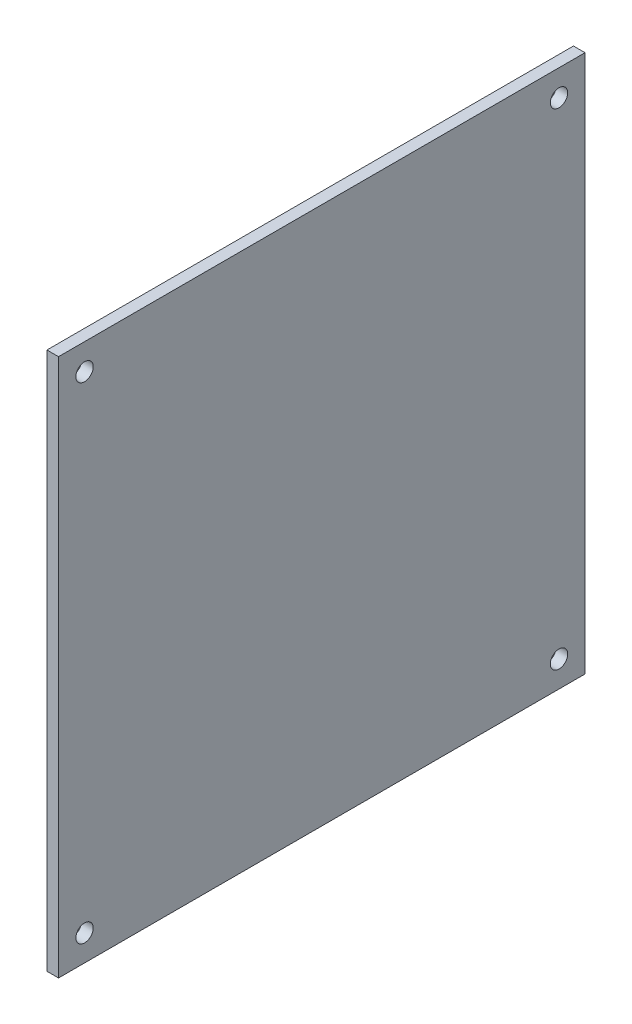
ISO-10303-21;
HEADER;
FILE_DESCRIPTION(('STEP AP214'),'2;1');
FILE_NAME('part.step','',(''),(''),'','','');
FILE_SCHEMA(('AUTOMOTIVE_DESIGN { 1 0 10303 214 1 1 1 1 }'));
ENDSEC;
DATA;
#1=APPLICATION_CONTEXT('core data for automotive mechanical design processes');
#2=APPLICATION_PROTOCOL_DEFINITION('international standard','automotive_design',2000,#1);
#3=PRODUCT_CONTEXT('',#1,'mechanical');
#4=PRODUCT('Part','Part','',(#3));
#5=PRODUCT_RELATED_PRODUCT_CATEGORY('part','',(#4));
#6=PRODUCT_DEFINITION_FORMATION('','',#4);
#7=PRODUCT_DEFINITION_CONTEXT('part definition',#1,'design');
#8=PRODUCT_DEFINITION('design','',#6,#7);
#9=PRODUCT_DEFINITION_SHAPE('','',#8);
#10=(LENGTH_UNIT() NAMED_UNIT(*) SI_UNIT(.MILLI.,.METRE.));
#11=(NAMED_UNIT(*) PLANE_ANGLE_UNIT() SI_UNIT($,.RADIAN.));
#12=(NAMED_UNIT(*) SI_UNIT($,.STERADIAN.) SOLID_ANGLE_UNIT());
#13=UNCERTAINTY_MEASURE_WITH_UNIT(LENGTH_MEASURE(1.E-05),#10,'distance_accuracy_value','');
#14=(GEOMETRIC_REPRESENTATION_CONTEXT(3) GLOBAL_UNCERTAINTY_ASSIGNED_CONTEXT((#13)) GLOBAL_UNIT_ASSIGNED_CONTEXT((#10,
#11,#12)) REPRESENTATION_CONTEXT('',''));
#15=CARTESIAN_POINT('',(0.,0.,0.));
#16=DIRECTION('',(0.,0.,1.));
#17=DIRECTION('',(1.,0.,0.));
#18=AXIS2_PLACEMENT_3D('',#15,#16,#17);
#19=CARTESIAN_POINT('',(2.,0.,0.));
#20=DIRECTION('',(1.,0.,0.));
#21=DIRECTION('',(0.,0.,-1.));
#22=AXIS2_PLACEMENT_3D('',#19,#20,#21);
#23=PLANE('',#22);
#24=CARTESIAN_POINT('',(2.,-38.802143102271,-55.6294933567625));
#25=DIRECTION('',(1.,0.,0.));
#26=DIRECTION('',(0.,0.,-1.));
#27=AXIS2_PLACEMENT_3D('',#24,#25,#26);
#28=CIRCLE('',#27,1.5);
#29=CARTESIAN_POINT('',(2.,-38.802143102271,-57.1294933567625));
#30=VERTEX_POINT('',#29);
#31=EDGE_CURVE('E123',#30,#30,#28,.T.);
#32=ORIENTED_EDGE('',*,*,#31,.F.);
#33=EDGE_LOOP('',(#32));
#34=FACE_BOUND('',#33,.T.);
#35=CARTESIAN_POINT('',(2.,45.197856897729,26.3705066432375));
#36=DIRECTION('',(1.,0.,0.));
#37=DIRECTION('',(0.,0.,-1.));
#38=AXIS2_PLACEMENT_3D('',#35,#36,#37);
#39=CIRCLE('',#38,1.5);
#40=CARTESIAN_POINT('',(2.,45.197856897729,24.8705066432375));
#41=VERTEX_POINT('',#40);
#42=EDGE_CURVE('E102',#41,#41,#39,.T.);
#43=ORIENTED_EDGE('',*,*,#42,.F.);
#44=EDGE_LOOP('',(#43));
#45=FACE_BOUND('',#44,.T.);
#46=DIRECTION('',(0.,-1.,0.));
#47=VECTOR('',#46,1.);
#48=CARTESIAN_POINT('',(2.,49.697856897729,30.8705066432375));
#49=LINE('',#48,#47);
#50=CARTESIAN_POINT('',(2.,49.697856897729,30.8705066432375));
#51=VERTEX_POINT('',#50);
#52=CARTESIAN_POINT('',(2.,-43.302143102271,30.8705066432375));
#53=VERTEX_POINT('',#52);
#54=EDGE_CURVE('E87',#51,#53,#49,.T.);
#55=ORIENTED_EDGE('',*,*,#54,.T.);
#56=DIRECTION('',(0.,0.,-1.));
#57=VECTOR('',#56,1.);
#58=CARTESIAN_POINT('',(2.,-43.302143102271,30.8705066432375));
#59=LINE('',#58,#57);
#60=CARTESIAN_POINT('',(2.,-43.302143102271,-60.1294933567625));
#61=VERTEX_POINT('',#60);
#62=EDGE_CURVE('E82',#53,#61,#59,.T.);
#63=ORIENTED_EDGE('',*,*,#62,.T.);
#64=DIRECTION('',(0.,1.,0.));
#65=VECTOR('',#64,1.);
#66=CARTESIAN_POINT('',(2.,49.697856897729,-60.1294933567625));
#67=LINE('',#66,#65);
#68=CARTESIAN_POINT('',(2.,49.697856897729,-60.1294933567625));
#69=VERTEX_POINT('',#68);
#70=EDGE_CURVE('E85',#61,#69,#67,.T.);
#71=ORIENTED_EDGE('',*,*,#70,.T.);
#72=DIRECTION('',(0.,0.,1.));
#73=VECTOR('',#72,1.);
#74=CARTESIAN_POINT('',(2.,49.697856897729,30.8705066432375));
#75=LINE('',#74,#73);
#76=EDGE_CURVE('E52',#69,#51,#75,.T.);
#77=ORIENTED_EDGE('',*,*,#76,.T.);
#78=EDGE_LOOP('',(#55,#63,#71,#77));
#79=FACE_BOUND('',#78,.T.);
#80=CARTESIAN_POINT('',(2.,45.197856897729,-55.6294933567625));
#81=DIRECTION('',(1.,0.,0.));
#82=DIRECTION('',(0.,0.,1.));
#83=AXIS2_PLACEMENT_3D('',#80,#81,#82);
#84=CIRCLE('',#83,1.5);
#85=CARTESIAN_POINT('',(2.,45.197856897729,-54.1294933567625));
#86=VERTEX_POINT('',#85);
#87=EDGE_CURVE('E117',#86,#86,#84,.T.);
#88=ORIENTED_EDGE('',*,*,#87,.F.);
#89=EDGE_LOOP('',(#88));
#90=FACE_BOUND('',#89,.T.);
#91=CARTESIAN_POINT('',(2.,-38.802143102271,26.3705066432375));
#92=DIRECTION('',(1.,0.,0.));
#93=DIRECTION('',(0.,0.,1.));
#94=AXIS2_PLACEMENT_3D('',#91,#92,#93);
#95=CIRCLE('',#94,1.5);
#96=CARTESIAN_POINT('',(2.,-38.802143102271,27.8705066432375));
#97=VERTEX_POINT('',#96);
#98=EDGE_CURVE('E129',#97,#97,#95,.T.);
#99=ORIENTED_EDGE('',*,*,#98,.F.);
#100=EDGE_LOOP('',(#99));
#101=FACE_BOUND('',#100,.T.);
#102=ADVANCED_FACE('F35',(#34,#45,#79,#90,#101),#23,.T.);
#103=CARTESIAN_POINT('',(0.,0.,0.));
#104=DIRECTION('',(1.,0.,0.));
#105=DIRECTION('',(0.,0.,-1.));
#106=AXIS2_PLACEMENT_3D('',#103,#104,#105);
#107=PLANE('',#106);
#108=DIRECTION('',(0.,-1.,0.));
#109=VECTOR('',#108,1.);
#110=CARTESIAN_POINT('',(0.,49.697856897729,30.8705066432375));
#111=LINE('',#110,#109);
#112=CARTESIAN_POINT('',(0.,49.697856897729,30.8705066432375));
#113=VERTEX_POINT('',#112);
#114=CARTESIAN_POINT('',(0.,-43.302143102271,30.8705066432375));
#115=VERTEX_POINT('',#114);
#116=EDGE_CURVE('E99',#113,#115,#111,.T.);
#117=ORIENTED_EDGE('',*,*,#116,.F.);
#118=DIRECTION('',(0.,0.,1.));
#119=VECTOR('',#118,1.);
#120=CARTESIAN_POINT('',(0.,49.697856897729,30.8705066432375));
#121=LINE('',#120,#119);
#122=CARTESIAN_POINT('',(0.,49.697856897729,-60.1294933567625));
#123=VERTEX_POINT('',#122);
#124=EDGE_CURVE('E75',#123,#113,#121,.T.);
#125=ORIENTED_EDGE('',*,*,#124,.F.);
#126=DIRECTION('',(0.,1.,0.));
#127=VECTOR('',#126,1.);
#128=CARTESIAN_POINT('',(0.,49.697856897729,-60.1294933567625));
#129=LINE('',#128,#127);
#130=CARTESIAN_POINT('',(0.,-43.302143102271,-60.1294933567625));
#131=VERTEX_POINT('',#130);
#132=EDGE_CURVE('E69',#131,#123,#129,.T.);
#133=ORIENTED_EDGE('',*,*,#132,.F.);
#134=DIRECTION('',(0.,0.,-1.));
#135=VECTOR('',#134,1.);
#136=CARTESIAN_POINT('',(0.,-43.302143102271,30.8705066432375));
#137=LINE('',#136,#135);
#138=EDGE_CURVE('E91',#115,#131,#137,.T.);
#139=ORIENTED_EDGE('',*,*,#138,.F.);
#140=EDGE_LOOP('',(#117,#125,#133,#139));
#141=FACE_BOUND('',#140,.T.);
#142=CARTESIAN_POINT('',(0.,45.197856897729,26.3705066432375));
#143=DIRECTION('',(1.,0.,0.));
#144=DIRECTION('',(0.,0.,-1.));
#145=AXIS2_PLACEMENT_3D('',#142,#143,#144);
#146=CIRCLE('',#145,1.5);
#147=CARTESIAN_POINT('',(0.,45.197856897729,24.8705066432375));
#148=VERTEX_POINT('',#147);
#149=EDGE_CURVE('E114',#148,#148,#146,.T.);
#150=ORIENTED_EDGE('',*,*,#149,.T.);
#151=EDGE_LOOP('',(#150));
#152=FACE_BOUND('',#151,.T.);
#153=CARTESIAN_POINT('',(0.,45.197856897729,-55.6294933567625));
#154=DIRECTION('',(1.,0.,0.));
#155=DIRECTION('',(0.,0.,1.));
#156=AXIS2_PLACEMENT_3D('',#153,#154,#155);
#157=CIRCLE('',#156,1.5);
#158=CARTESIAN_POINT('',(0.,45.197856897729,-54.1294933567625));
#159=VERTEX_POINT('',#158);
#160=EDGE_CURVE('E120',#159,#159,#157,.T.);
#161=ORIENTED_EDGE('',*,*,#160,.T.);
#162=EDGE_LOOP('',(#161));
#163=FACE_BOUND('',#162,.T.);
#164=CARTESIAN_POINT('',(0.,-38.802143102271,-55.6294933567625));
#165=DIRECTION('',(1.,0.,0.));
#166=DIRECTION('',(0.,0.,-1.));
#167=AXIS2_PLACEMENT_3D('',#164,#165,#166);
#168=CIRCLE('',#167,1.5);
#169=CARTESIAN_POINT('',(0.,-38.802143102271,-57.1294933567625));
#170=VERTEX_POINT('',#169);
#171=EDGE_CURVE('E126',#170,#170,#168,.T.);
#172=ORIENTED_EDGE('',*,*,#171,.T.);
#173=EDGE_LOOP('',(#172));
#174=FACE_BOUND('',#173,.T.);
#175=CARTESIAN_POINT('',(0.,-38.802143102271,26.3705066432375));
#176=DIRECTION('',(1.,0.,0.));
#177=DIRECTION('',(0.,0.,1.));
#178=AXIS2_PLACEMENT_3D('',#175,#176,#177);
#179=CIRCLE('',#178,1.5);
#180=CARTESIAN_POINT('',(0.,-38.802143102271,27.8705066432375));
#181=VERTEX_POINT('',#180);
#182=EDGE_CURVE('E132',#181,#181,#179,.T.);
#183=ORIENTED_EDGE('',*,*,#182,.T.);
#184=EDGE_LOOP('',(#183));
#185=FACE_BOUND('',#184,.T.);
#186=ADVANCED_FACE('F110',(#141,#152,#163,#174,#185),#107,.F.);
#187=CARTESIAN_POINT('',(2.,49.697856897729,30.8705066432375));
#188=DIRECTION('',(0.,0.,-1.));
#189=DIRECTION('',(0.,1.,0.));
#190=AXIS2_PLACEMENT_3D('',#187,#188,#189);
#191=PLANE('',#190);
#192=ORIENTED_EDGE('',*,*,#116,.T.);
#193=DIRECTION('',(-1.,0.,0.));
#194=VECTOR('',#193,1.);
#195=CARTESIAN_POINT('',(2.,-43.302143102271,30.8705066432375));
#196=LINE('',#195,#194);
#197=EDGE_CURVE('E11',#53,#115,#196,.T.);
#198=ORIENTED_EDGE('',*,*,#197,.F.);
#199=ORIENTED_EDGE('',*,*,#54,.F.);
#200=DIRECTION('',(-1.,0.,0.));
#201=VECTOR('',#200,1.);
#202=CARTESIAN_POINT('',(2.,49.697856897729,30.8705066432375));
#203=LINE('',#202,#201);
#204=EDGE_CURVE('E95',#51,#113,#203,.T.);
#205=ORIENTED_EDGE('',*,*,#204,.T.);
#206=EDGE_LOOP('',(#192,#198,#199,#205));
#207=FACE_BOUND('',#206,.T.);
#208=ADVANCED_FACE('F37',(#207),#191,.F.);
#209=CARTESIAN_POINT('',(2.,-43.302143102271,30.8705066432375));
#210=DIRECTION('',(0.,1.,0.));
#211=DIRECTION('',(0.,0.,1.));
#212=AXIS2_PLACEMENT_3D('',#209,#210,#211);
#213=PLANE('',#212);
#214=ORIENTED_EDGE('',*,*,#138,.T.);
#215=DIRECTION('',(-1.,0.,0.));
#216=VECTOR('',#215,1.);
#217=CARTESIAN_POINT('',(2.,-43.302143102271,-60.1294933567625));
#218=LINE('',#217,#216);
#219=EDGE_CURVE('E44',#61,#131,#218,.T.);
#220=ORIENTED_EDGE('',*,*,#219,.F.);
#221=ORIENTED_EDGE('',*,*,#62,.F.);
#222=ORIENTED_EDGE('',*,*,#197,.T.);
#223=EDGE_LOOP('',(#214,#220,#221,#222));
#224=FACE_BOUND('',#223,.T.);
#225=ADVANCED_FACE('F90',(#224),#213,.F.);
#226=CARTESIAN_POINT('',(2.,49.697856897729,-60.1294933567625));
#227=DIRECTION('',(0.,0.,1.));
#228=DIRECTION('',(0.,-1.,0.));
#229=AXIS2_PLACEMENT_3D('',#226,#227,#228);
#230=PLANE('',#229);
#231=ORIENTED_EDGE('',*,*,#132,.T.);
#232=DIRECTION('',(-1.,0.,0.));
#233=VECTOR('',#232,1.);
#234=CARTESIAN_POINT('',(2.,49.697856897729,-60.1294933567625));
#235=LINE('',#234,#233);
#236=EDGE_CURVE('E92',#69,#123,#235,.T.);
#237=ORIENTED_EDGE('',*,*,#236,.F.);
#238=ORIENTED_EDGE('',*,*,#70,.F.);
#239=ORIENTED_EDGE('',*,*,#219,.T.);
#240=EDGE_LOOP('',(#231,#237,#238,#239));
#241=FACE_BOUND('',#240,.T.);
#242=ADVANCED_FACE('F93',(#241),#230,.F.);
#243=CARTESIAN_POINT('',(2.,49.697856897729,30.8705066432375));
#244=DIRECTION('',(0.,-1.,0.));
#245=DIRECTION('',(0.,0.,-1.));
#246=AXIS2_PLACEMENT_3D('',#243,#244,#245);
#247=PLANE('',#246);
#248=ORIENTED_EDGE('',*,*,#124,.T.);
#249=ORIENTED_EDGE('',*,*,#204,.F.);
#250=ORIENTED_EDGE('',*,*,#76,.F.);
#251=ORIENTED_EDGE('',*,*,#236,.T.);
#252=EDGE_LOOP('',(#248,#249,#250,#251));
#253=FACE_BOUND('',#252,.T.);
#254=ADVANCED_FACE('F107',(#253),#247,.F.);
#255=CARTESIAN_POINT('',(2.,45.197856897729,26.3705066432375));
#256=DIRECTION('',(-1.,0.,0.));
#257=DIRECTION('',(0.,0.,1.));
#258=AXIS2_PLACEMENT_3D('',#255,#256,#257);
#259=CYLINDRICAL_SURFACE('',#258,1.5);
#260=ORIENTED_EDGE('',*,*,#42,.T.);
#261=EDGE_LOOP('',(#260));
#262=FACE_BOUND('',#261,.T.);
#263=ORIENTED_EDGE('',*,*,#149,.F.);
#264=EDGE_LOOP('',(#263));
#265=FACE_BOUND('',#264,.T.);
#266=ADVANCED_FACE('F151',(#262,#265),#259,.F.);
#267=CARTESIAN_POINT('',(2.,45.197856897729,-55.6294933567625));
#268=DIRECTION('',(-1.,0.,0.));
#269=DIRECTION('',(0.,0.,1.));
#270=AXIS2_PLACEMENT_3D('',#267,#268,#269);
#271=CYLINDRICAL_SURFACE('',#270,1.5);
#272=ORIENTED_EDGE('',*,*,#87,.T.);
#273=EDGE_LOOP('',(#272));
#274=FACE_BOUND('',#273,.T.);
#275=ORIENTED_EDGE('',*,*,#160,.F.);
#276=EDGE_LOOP('',(#275));
#277=FACE_BOUND('',#276,.T.);
#278=ADVANCED_FACE('F197',(#274,#277),#271,.F.);
#279=CARTESIAN_POINT('',(2.,-38.802143102271,-55.6294933567625));
#280=DIRECTION('',(-1.,0.,0.));
#281=DIRECTION('',(0.,0.,1.));
#282=AXIS2_PLACEMENT_3D('',#279,#280,#281);
#283=CYLINDRICAL_SURFACE('',#282,1.5);
#284=ORIENTED_EDGE('',*,*,#31,.T.);
#285=EDGE_LOOP('',(#284));
#286=FACE_BOUND('',#285,.T.);
#287=ORIENTED_EDGE('',*,*,#171,.F.);
#288=EDGE_LOOP('',(#287));
#289=FACE_BOUND('',#288,.T.);
#290=ADVANCED_FACE('F205',(#286,#289),#283,.F.);
#291=CARTESIAN_POINT('',(2.,-38.802143102271,26.3705066432375));
#292=DIRECTION('',(-1.,0.,0.));
#293=DIRECTION('',(0.,0.,1.));
#294=AXIS2_PLACEMENT_3D('',#291,#292,#293);
#295=CYLINDRICAL_SURFACE('',#294,1.5);
#296=ORIENTED_EDGE('',*,*,#98,.T.);
#297=EDGE_LOOP('',(#296));
#298=FACE_BOUND('',#297,.T.);
#299=ORIENTED_EDGE('',*,*,#182,.F.);
#300=EDGE_LOOP('',(#299));
#301=FACE_BOUND('',#300,.T.);
#302=ADVANCED_FACE('F138',(#298,#301),#295,.F.);
#303=CLOSED_SHELL('',(#102,#186,#208,#225,#242,#254,#266,#278,#290,#302));
#304=MANIFOLD_SOLID_BREP('B2',#303);
#305=ADVANCED_BREP_SHAPE_REPRESENTATION('',(#18,#304),#14);
#306=SHAPE_DEFINITION_REPRESENTATION(#9,#305);
ENDSEC;
END-ISO-10303-21;
